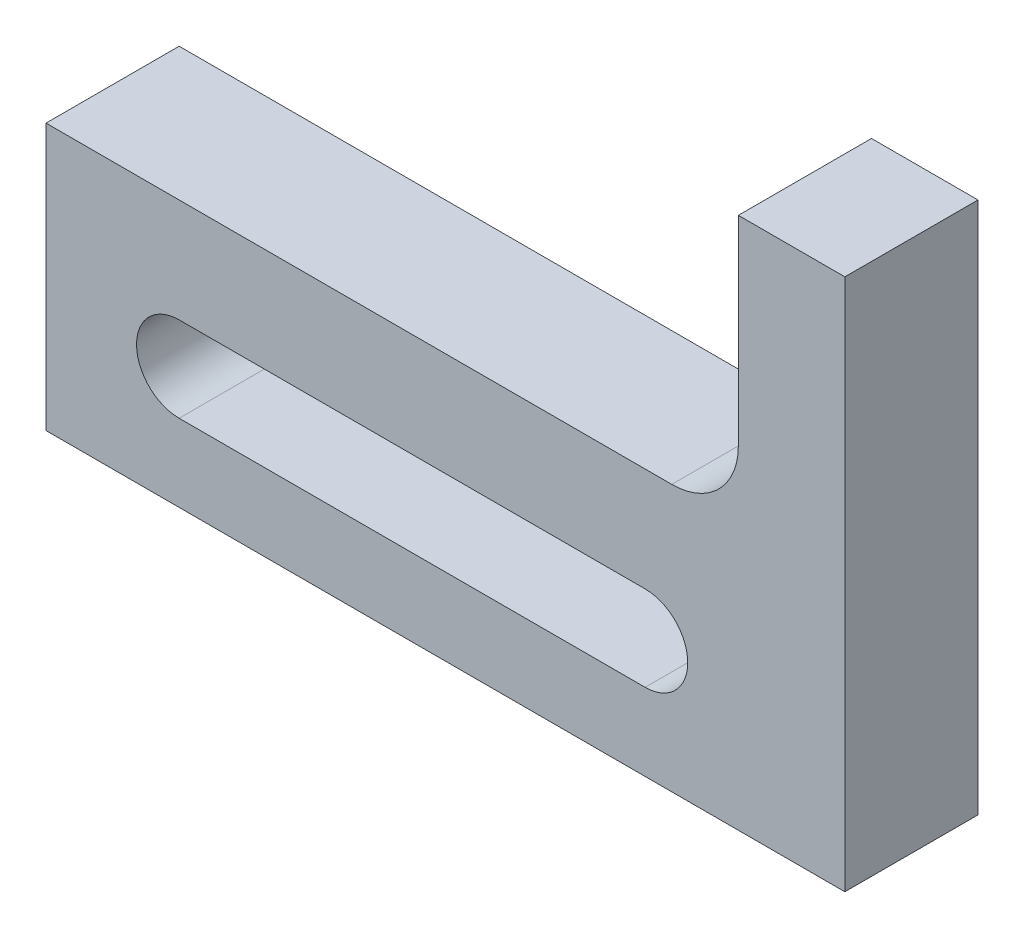
ISO-10303-21;
HEADER;
FILE_DESCRIPTION(('STEP AP214'),'2;1');
FILE_NAME('part.step','',(''),(''),'','','');
FILE_SCHEMA(('AUTOMOTIVE_DESIGN { 1 0 10303 214 1 1 1 1 }'));
ENDSEC;
DATA;
#1=APPLICATION_CONTEXT('core data for automotive mechanical design processes');
#2=APPLICATION_PROTOCOL_DEFINITION('international standard','automotive_design',2000,#1);
#3=PRODUCT_CONTEXT('',#1,'mechanical');
#4=PRODUCT('Part','Part','',(#3));
#5=PRODUCT_RELATED_PRODUCT_CATEGORY('part','',(#4));
#6=PRODUCT_DEFINITION_FORMATION('','',#4);
#7=PRODUCT_DEFINITION_CONTEXT('part definition',#1,'design');
#8=PRODUCT_DEFINITION('design','',#6,#7);
#9=PRODUCT_DEFINITION_SHAPE('','',#8);
#10=(LENGTH_UNIT() NAMED_UNIT(*) SI_UNIT(.MILLI.,.METRE.));
#11=(NAMED_UNIT(*) PLANE_ANGLE_UNIT() SI_UNIT($,.RADIAN.));
#12=(NAMED_UNIT(*) SI_UNIT($,.STERADIAN.) SOLID_ANGLE_UNIT());
#13=UNCERTAINTY_MEASURE_WITH_UNIT(LENGTH_MEASURE(1.E-05),#10,'distance_accuracy_value','');
#14=(GEOMETRIC_REPRESENTATION_CONTEXT(3) GLOBAL_UNCERTAINTY_ASSIGNED_CONTEXT((#13)) GLOBAL_UNIT_ASSIGNED_CONTEXT((#10,
#11,#12)) REPRESENTATION_CONTEXT('',''));
#15=CARTESIAN_POINT('',(0.,0.,0.));
#16=DIRECTION('',(0.,0.,1.));
#17=DIRECTION('',(1.,0.,0.));
#18=AXIS2_PLACEMENT_3D('',#15,#16,#17);
#19=CARTESIAN_POINT('',(0.,0.,10.));
#20=DIRECTION('',(1.,0.,0.));
#21=DIRECTION('',(0.,0.,-1.));
#22=AXIS2_PLACEMENT_3D('',#19,#20,#21);
#23=PLANE('',#22);
#24=DIRECTION('',(0.,-1.,0.));
#25=VECTOR('',#24,1.);
#26=CARTESIAN_POINT('',(0.,0.,10.));
#27=LINE('',#26,#25);
#28=CARTESIAN_POINT('',(0.,20.,10.));
#29=VERTEX_POINT('',#28);
#30=CARTESIAN_POINT('',(0.,0.,10.));
#31=VERTEX_POINT('',#30);
#32=EDGE_CURVE('E167',#29,#31,#27,.T.);
#33=ORIENTED_EDGE('',*,*,#32,.F.);
#34=DIRECTION('',(0.,0.,1.));
#35=VECTOR('',#34,1.);
#36=CARTESIAN_POINT('',(0.,20.,0.));
#37=LINE('',#36,#35);
#38=CARTESIAN_POINT('',(0.,20.,0.));
#39=VERTEX_POINT('',#38);
#40=EDGE_CURVE('E158',#39,#29,#37,.T.);
#41=ORIENTED_EDGE('',*,*,#40,.F.);
#42=DIRECTION('',(0.,-1.,0.));
#43=VECTOR('',#42,1.);
#44=CARTESIAN_POINT('',(0.,0.,0.));
#45=LINE('',#44,#43);
#46=CARTESIAN_POINT('',(0.,0.,0.));
#47=VERTEX_POINT('',#46);
#48=EDGE_CURVE('E165',#39,#47,#45,.T.);
#49=ORIENTED_EDGE('',*,*,#48,.T.);
#50=DIRECTION('',(0.,0.,-1.));
#51=VECTOR('',#50,1.);
#52=CARTESIAN_POINT('',(0.,0.,10.));
#53=LINE('',#52,#51);
#54=EDGE_CURVE('E190',#31,#47,#53,.T.);
#55=ORIENTED_EDGE('',*,*,#54,.F.);
#56=EDGE_LOOP('',(#33,#41,#49,#55));
#57=FACE_BOUND('',#56,.T.);
#58=ADVANCED_FACE('F33',(#57),#23,.F.);
#59=CARTESIAN_POINT('',(0.,0.,10.));
#60=DIRECTION('',(0.,1.,0.));
#61=DIRECTION('',(0.,0.,1.));
#62=AXIS2_PLACEMENT_3D('',#59,#60,#61);
#63=PLANE('',#62);
#64=DIRECTION('',(1.,0.,0.));
#65=VECTOR('',#64,1.);
#66=CARTESIAN_POINT('',(0.,0.,0.));
#67=LINE('',#66,#65);
#68=CARTESIAN_POINT('',(60.,0.,0.));
#69=VERTEX_POINT('',#68);
#70=EDGE_CURVE('E179',#47,#69,#67,.T.);
#71=ORIENTED_EDGE('',*,*,#70,.T.);
#72=DIRECTION('',(0.,0.,-1.));
#73=VECTOR('',#72,1.);
#74=CARTESIAN_POINT('',(60.,0.,10.));
#75=LINE('',#74,#73);
#76=CARTESIAN_POINT('',(60.,0.,10.));
#77=VERTEX_POINT('',#76);
#78=EDGE_CURVE('E187',#77,#69,#75,.T.);
#79=ORIENTED_EDGE('',*,*,#78,.F.);
#80=DIRECTION('',(1.,0.,0.));
#81=VECTOR('',#80,1.);
#82=CARTESIAN_POINT('',(0.,0.,10.));
#83=LINE('',#82,#81);
#84=EDGE_CURVE('E169',#31,#77,#83,.T.);
#85=ORIENTED_EDGE('',*,*,#84,.F.);
#86=ORIENTED_EDGE('',*,*,#54,.T.);
#87=EDGE_LOOP('',(#71,#79,#85,#86));
#88=FACE_BOUND('',#87,.T.);
#89=ADVANCED_FACE('F227',(#88),#63,.F.);
#90=CARTESIAN_POINT('',(60.,0.,10.));
#91=DIRECTION('',(-1.,0.,0.));
#92=DIRECTION('',(0.,0.,1.));
#93=AXIS2_PLACEMENT_3D('',#90,#91,#92);
#94=PLANE('',#93);
#95=DIRECTION('',(0.,1.,0.));
#96=VECTOR('',#95,1.);
#97=CARTESIAN_POINT('',(60.,0.,0.));
#98=LINE('',#97,#96);
#99=CARTESIAN_POINT('',(60.,40.,0.));
#100=VERTEX_POINT('',#99);
#101=EDGE_CURVE('E181',#69,#100,#98,.T.);
#102=ORIENTED_EDGE('',*,*,#101,.T.);
#103=DIRECTION('',(0.,0.,-1.));
#104=VECTOR('',#103,1.);
#105=CARTESIAN_POINT('',(60.,40.,10.));
#106=LINE('',#105,#104);
#107=CARTESIAN_POINT('',(60.,40.,10.));
#108=VERTEX_POINT('',#107);
#109=EDGE_CURVE('E177',#108,#100,#106,.T.);
#110=ORIENTED_EDGE('',*,*,#109,.F.);
#111=DIRECTION('',(0.,1.,0.));
#112=VECTOR('',#111,1.);
#113=CARTESIAN_POINT('',(60.,0.,10.));
#114=LINE('',#113,#112);
#115=EDGE_CURVE('E172',#77,#108,#114,.T.);
#116=ORIENTED_EDGE('',*,*,#115,.F.);
#117=ORIENTED_EDGE('',*,*,#78,.T.);
#118=EDGE_LOOP('',(#102,#110,#116,#117));
#119=FACE_BOUND('',#118,.T.);
#120=ADVANCED_FACE('F222',(#119),#94,.F.);
#121=CARTESIAN_POINT('',(0.,40.,10.));
#122=DIRECTION('',(0.,-1.,0.));
#123=DIRECTION('',(0.,0.,-1.));
#124=AXIS2_PLACEMENT_3D('',#121,#122,#123);
#125=PLANE('',#124);
#126=DIRECTION('',(-1.,0.,0.));
#127=VECTOR('',#126,1.);
#128=CARTESIAN_POINT('',(0.,40.,0.));
#129=LINE('',#128,#127);
#130=CARTESIAN_POINT('',(52.,40.,0.));
#131=VERTEX_POINT('',#130);
#132=EDGE_CURVE('E170',#100,#131,#129,.T.);
#133=ORIENTED_EDGE('',*,*,#132,.T.);
#134=DIRECTION('',(0.,0.,1.));
#135=VECTOR('',#134,1.);
#136=CARTESIAN_POINT('',(52.,40.,0.));
#137=LINE('',#136,#135);
#138=CARTESIAN_POINT('',(52.,40.,10.));
#139=VERTEX_POINT('',#138);
#140=EDGE_CURVE('E162',#131,#139,#137,.T.);
#141=ORIENTED_EDGE('',*,*,#140,.T.);
#142=DIRECTION('',(-1.,0.,0.));
#143=VECTOR('',#142,1.);
#144=CARTESIAN_POINT('',(0.,40.,10.));
#145=LINE('',#144,#143);
#146=EDGE_CURVE('E174',#108,#139,#145,.T.);
#147=ORIENTED_EDGE('',*,*,#146,.F.);
#148=ORIENTED_EDGE('',*,*,#109,.T.);
#149=EDGE_LOOP('',(#133,#141,#147,#148));
#150=FACE_BOUND('',#149,.T.);
#151=ADVANCED_FACE('F217',(#150),#125,.F.);
#152=CARTESIAN_POINT('',(0.,40.,10.));
#153=DIRECTION('',(0.,0.,-1.));
#154=DIRECTION('',(-1.,0.,0.));
#155=AXIS2_PLACEMENT_3D('',#152,#153,#154);
#156=PLANE('',#155);
#157=DIRECTION('',(1.,0.,0.));
#158=VECTOR('',#157,1.);
#159=CARTESIAN_POINT('',(10.,5.8,10.));
#160=LINE('',#159,#158);
#161=CARTESIAN_POINT('',(10.,5.8,10.));
#162=VERTEX_POINT('',#161);
#163=CARTESIAN_POINT('',(45.,5.8,10.));
#164=VERTEX_POINT('',#163);
#165=EDGE_CURVE('E142',#162,#164,#160,.T.);
#166=ORIENTED_EDGE('',*,*,#165,.F.);
#167=CARTESIAN_POINT('',(10.,9.,10.));
#168=DIRECTION('',(0.,0.,1.));
#169=DIRECTION('',(1.,0.,0.));
#170=AXIS2_PLACEMENT_3D('',#167,#168,#169);
#171=CIRCLE('',#170,3.2);
#172=CARTESIAN_POINT('',(10.,12.2,10.));
#173=VERTEX_POINT('',#172);
#174=EDGE_CURVE('E48',#173,#162,#171,.T.);
#175=ORIENTED_EDGE('',*,*,#174,.F.);
#176=DIRECTION('',(-1.,0.,0.));
#177=VECTOR('',#176,1.);
#178=CARTESIAN_POINT('',(10.,12.2,10.));
#179=LINE('',#178,#177);
#180=CARTESIAN_POINT('',(45.,12.2,10.));
#181=VERTEX_POINT('',#180);
#182=EDGE_CURVE('E133',#181,#173,#179,.T.);
#183=ORIENTED_EDGE('',*,*,#182,.F.);
#184=CARTESIAN_POINT('',(45.,9.,10.));
#185=DIRECTION('',(0.,0.,1.));
#186=DIRECTION('',(1.,0.,0.));
#187=AXIS2_PLACEMENT_3D('',#184,#185,#186);
#188=CIRCLE('',#187,3.2);
#189=EDGE_CURVE('E136',#164,#181,#188,.T.);
#190=ORIENTED_EDGE('',*,*,#189,.F.);
#191=EDGE_LOOP('',(#166,#175,#183,#190));
#192=FACE_BOUND('',#191,.T.);
#193=ORIENTED_EDGE('',*,*,#146,.T.);
#194=DIRECTION('',(0.,1.,0.));
#195=VECTOR('',#194,1.);
#196=CARTESIAN_POINT('',(52.,40.,10.));
#197=LINE('',#196,#195);
#198=CARTESIAN_POINT('',(52.,25.,10.));
#199=VERTEX_POINT('',#198);
#200=EDGE_CURVE('E156',#199,#139,#197,.T.);
#201=ORIENTED_EDGE('',*,*,#200,.F.);
#202=CARTESIAN_POINT('',(47.,25.,10.));
#203=DIRECTION('',(0.,0.,-1.));
#204=DIRECTION('',(-1.,0.,0.));
#205=AXIS2_PLACEMENT_3D('',#202,#203,#204);
#206=CIRCLE('',#205,5.);
#207=CARTESIAN_POINT('',(47.,20.,10.));
#208=VERTEX_POINT('',#207);
#209=EDGE_CURVE('E41',#199,#208,#206,.T.);
#210=ORIENTED_EDGE('',*,*,#209,.T.);
#211=DIRECTION('',(1.,0.,0.));
#212=VECTOR('',#211,1.);
#213=CARTESIAN_POINT('',(0.,20.,10.));
#214=LINE('',#213,#212);
#215=EDGE_CURVE('E148',#29,#208,#214,.T.);
#216=ORIENTED_EDGE('',*,*,#215,.F.);
#217=ORIENTED_EDGE('',*,*,#32,.T.);
#218=ORIENTED_EDGE('',*,*,#84,.T.);
#219=ORIENTED_EDGE('',*,*,#115,.T.);
#220=EDGE_LOOP('',(#193,#201,#210,#216,#217,#218,#219));
#221=FACE_BOUND('',#220,.T.);
#222=ADVANCED_FACE('F200',(#192,#221),#156,.F.);
#223=CARTESIAN_POINT('',(0.,40.,0.));
#224=DIRECTION('',(0.,0.,-1.));
#225=DIRECTION('',(-1.,0.,0.));
#226=AXIS2_PLACEMENT_3D('',#223,#224,#225);
#227=PLANE('',#226);
#228=CARTESIAN_POINT('',(10.,9.,0.));
#229=DIRECTION('',(0.,0.,1.));
#230=DIRECTION('',(1.,0.,0.));
#231=AXIS2_PLACEMENT_3D('',#228,#229,#230);
#232=CIRCLE('',#231,3.2);
#233=CARTESIAN_POINT('',(10.,12.2,0.));
#234=VERTEX_POINT('',#233);
#235=CARTESIAN_POINT('',(10.,5.8,0.));
#236=VERTEX_POINT('',#235);
#237=EDGE_CURVE('E117',#234,#236,#232,.T.);
#238=ORIENTED_EDGE('',*,*,#237,.T.);
#239=DIRECTION('',(1.,0.,0.));
#240=VECTOR('',#239,1.);
#241=CARTESIAN_POINT('',(10.,5.8,0.));
#242=LINE('',#241,#240);
#243=CARTESIAN_POINT('',(45.,5.8,0.));
#244=VERTEX_POINT('',#243);
#245=EDGE_CURVE('E126',#236,#244,#242,.T.);
#246=ORIENTED_EDGE('',*,*,#245,.T.);
#247=CARTESIAN_POINT('',(45.,9.,0.));
#248=DIRECTION('',(0.,0.,1.));
#249=DIRECTION('',(1.,0.,0.));
#250=AXIS2_PLACEMENT_3D('',#247,#248,#249);
#251=CIRCLE('',#250,3.2);
#252=CARTESIAN_POINT('',(45.,12.2,0.));
#253=VERTEX_POINT('',#252);
#254=EDGE_CURVE('E56',#244,#253,#251,.T.);
#255=ORIENTED_EDGE('',*,*,#254,.T.);
#256=DIRECTION('',(-1.,0.,0.));
#257=VECTOR('',#256,1.);
#258=CARTESIAN_POINT('',(10.,12.2,0.));
#259=LINE('',#258,#257);
#260=EDGE_CURVE('E123',#253,#234,#259,.T.);
#261=ORIENTED_EDGE('',*,*,#260,.T.);
#262=EDGE_LOOP('',(#238,#246,#255,#261));
#263=FACE_BOUND('',#262,.T.);
#264=DIRECTION('',(1.,0.,0.));
#265=VECTOR('',#264,1.);
#266=CARTESIAN_POINT('',(0.,20.,0.));
#267=LINE('',#266,#265);
#268=CARTESIAN_POINT('',(47.,20.,0.));
#269=VERTEX_POINT('',#268);
#270=EDGE_CURVE('E152',#39,#269,#267,.T.);
#271=ORIENTED_EDGE('',*,*,#270,.T.);
#272=CARTESIAN_POINT('',(47.,25.,0.));
#273=DIRECTION('',(0.,0.,-1.));
#274=DIRECTION('',(-1.,0.,0.));
#275=AXIS2_PLACEMENT_3D('',#272,#273,#274);
#276=CIRCLE('',#275,5.);
#277=CARTESIAN_POINT('',(52.,25.,0.));
#278=VERTEX_POINT('',#277);
#279=EDGE_CURVE('E11',#269,#278,#276,.F.);
#280=ORIENTED_EDGE('',*,*,#279,.T.);
#281=DIRECTION('',(0.,1.,0.));
#282=VECTOR('',#281,1.);
#283=CARTESIAN_POINT('',(52.,40.,0.));
#284=LINE('',#283,#282);
#285=EDGE_CURVE('E155',#278,#131,#284,.T.);
#286=ORIENTED_EDGE('',*,*,#285,.T.);
#287=ORIENTED_EDGE('',*,*,#132,.F.);
#288=ORIENTED_EDGE('',*,*,#101,.F.);
#289=ORIENTED_EDGE('',*,*,#70,.F.);
#290=ORIENTED_EDGE('',*,*,#48,.F.);
#291=EDGE_LOOP('',(#271,#280,#286,#287,#288,#289,#290));
#292=FACE_BOUND('',#291,.T.);
#293=ADVANCED_FACE('F130',(#263,#292),#227,.T.);
#294=CARTESIAN_POINT('',(52.,40.,0.));
#295=DIRECTION('',(1.,0.,0.));
#296=DIRECTION('',(0.,0.,-1.));
#297=AXIS2_PLACEMENT_3D('',#294,#295,#296);
#298=PLANE('',#297);
#299=ORIENTED_EDGE('',*,*,#285,.F.);
#300=DIRECTION('',(0.,0.,1.));
#301=VECTOR('',#300,1.);
#302=CARTESIAN_POINT('',(52.,25.,10.));
#303=LINE('',#302,#301);
#304=EDGE_CURVE('E193',#278,#199,#303,.T.);
#305=ORIENTED_EDGE('',*,*,#304,.T.);
#306=ORIENTED_EDGE('',*,*,#200,.T.);
#307=ORIENTED_EDGE('',*,*,#140,.F.);
#308=EDGE_LOOP('',(#299,#305,#306,#307));
#309=FACE_BOUND('',#308,.T.);
#310=ADVANCED_FACE('F214',(#309),#298,.F.);
#311=CARTESIAN_POINT('',(0.,20.,0.));
#312=DIRECTION('',(0.,-1.,0.));
#313=DIRECTION('',(0.,0.,-1.));
#314=AXIS2_PLACEMENT_3D('',#311,#312,#313);
#315=PLANE('',#314);
#316=ORIENTED_EDGE('',*,*,#215,.T.);
#317=DIRECTION('',(0.,0.,1.));
#318=VECTOR('',#317,1.);
#319=CARTESIAN_POINT('',(47.,20.,0.));
#320=LINE('',#319,#318);
#321=EDGE_CURVE('E196',#208,#269,#320,.F.);
#322=ORIENTED_EDGE('',*,*,#321,.T.);
#323=ORIENTED_EDGE('',*,*,#270,.F.);
#324=ORIENTED_EDGE('',*,*,#40,.T.);
#325=EDGE_LOOP('',(#316,#322,#323,#324));
#326=FACE_BOUND('',#325,.T.);
#327=ADVANCED_FACE('F206',(#326),#315,.F.);
#328=CARTESIAN_POINT('',(47.,25.,0.));
#329=DIRECTION('',(0.,0.,-1.));
#330=DIRECTION('',(-1.,0.,0.));
#331=AXIS2_PLACEMENT_3D('',#328,#329,#330);
#332=CYLINDRICAL_SURFACE('',#331,5.);
#333=ORIENTED_EDGE('',*,*,#279,.F.);
#334=ORIENTED_EDGE('',*,*,#321,.F.);
#335=ORIENTED_EDGE('',*,*,#209,.F.);
#336=ORIENTED_EDGE('',*,*,#304,.F.);
#337=EDGE_LOOP('',(#333,#334,#335,#336));
#338=FACE_BOUND('',#337,.T.);
#339=ADVANCED_FACE('F35',(#338),#332,.F.);
#340=CARTESIAN_POINT('',(10.,9.,0.));
#341=DIRECTION('',(0.,0.,1.));
#342=DIRECTION('',(1.,0.,0.));
#343=AXIS2_PLACEMENT_3D('',#340,#341,#342);
#344=CYLINDRICAL_SURFACE('',#343,3.2);
#345=ORIENTED_EDGE('',*,*,#174,.T.);
#346=DIRECTION('',(0.,0.,1.));
#347=VECTOR('',#346,1.);
#348=CARTESIAN_POINT('',(10.,5.8,0.));
#349=LINE('',#348,#347);
#350=EDGE_CURVE('E113',#236,#162,#349,.T.);
#351=ORIENTED_EDGE('',*,*,#350,.F.);
#352=ORIENTED_EDGE('',*,*,#237,.F.);
#353=DIRECTION('',(0.,0.,1.));
#354=VECTOR('',#353,1.);
#355=CARTESIAN_POINT('',(10.,12.2,0.));
#356=LINE('',#355,#354);
#357=EDGE_CURVE('E146',#234,#173,#356,.T.);
#358=ORIENTED_EDGE('',*,*,#357,.T.);
#359=EDGE_LOOP('',(#345,#351,#352,#358));
#360=FACE_BOUND('',#359,.T.);
#361=ADVANCED_FACE('F115',(#360),#344,.F.);
#362=CARTESIAN_POINT('',(10.,12.2,0.));
#363=DIRECTION('',(0.,1.,0.));
#364=DIRECTION('',(0.,0.,1.));
#365=AXIS2_PLACEMENT_3D('',#362,#363,#364);
#366=PLANE('',#365);
#367=ORIENTED_EDGE('',*,*,#182,.T.);
#368=ORIENTED_EDGE('',*,*,#357,.F.);
#369=ORIENTED_EDGE('',*,*,#260,.F.);
#370=DIRECTION('',(0.,0.,1.));
#371=VECTOR('',#370,1.);
#372=CARTESIAN_POINT('',(45.,12.2,0.));
#373=LINE('',#372,#371);
#374=EDGE_CURVE('E149',#253,#181,#373,.T.);
#375=ORIENTED_EDGE('',*,*,#374,.T.);
#376=EDGE_LOOP('',(#367,#368,#369,#375));
#377=FACE_BOUND('',#376,.T.);
#378=ADVANCED_FACE('F251',(#377),#366,.F.);
#379=CARTESIAN_POINT('',(45.,9.,0.));
#380=DIRECTION('',(0.,0.,1.));
#381=DIRECTION('',(1.,0.,0.));
#382=AXIS2_PLACEMENT_3D('',#379,#380,#381);
#383=CYLINDRICAL_SURFACE('',#382,3.2);
#384=ORIENTED_EDGE('',*,*,#189,.T.);
#385=ORIENTED_EDGE('',*,*,#374,.F.);
#386=ORIENTED_EDGE('',*,*,#254,.F.);
#387=DIRECTION('',(0.,0.,1.));
#388=VECTOR('',#387,1.);
#389=CARTESIAN_POINT('',(45.,5.8,0.));
#390=LINE('',#389,#388);
#391=EDGE_CURVE('E122',#244,#164,#390,.T.);
#392=ORIENTED_EDGE('',*,*,#391,.T.);
#393=EDGE_LOOP('',(#384,#385,#386,#392));
#394=FACE_BOUND('',#393,.T.);
#395=ADVANCED_FACE('F254',(#394),#383,.F.);
#396=CARTESIAN_POINT('',(10.,5.8,0.));
#397=DIRECTION('',(0.,-1.,0.));
#398=DIRECTION('',(0.,0.,-1.));
#399=AXIS2_PLACEMENT_3D('',#396,#397,#398);
#400=PLANE('',#399);
#401=ORIENTED_EDGE('',*,*,#165,.T.);
#402=ORIENTED_EDGE('',*,*,#391,.F.);
#403=ORIENTED_EDGE('',*,*,#245,.F.);
#404=ORIENTED_EDGE('',*,*,#350,.T.);
#405=EDGE_LOOP('',(#401,#402,#403,#404));
#406=FACE_BOUND('',#405,.T.);
#407=ADVANCED_FACE('F127',(#406),#400,.F.);
#408=CLOSED_SHELL('',(#58,#89,#120,#151,#222,#293,#310,#327,#339,#361,#378,#395,#407));
#409=MANIFOLD_SOLID_BREP('B2',#408);
#410=ADVANCED_BREP_SHAPE_REPRESENTATION('',(#18,#409),#14);
#411=SHAPE_DEFINITION_REPRESENTATION(#9,#410);
ENDSEC;
END-ISO-10303-21;
